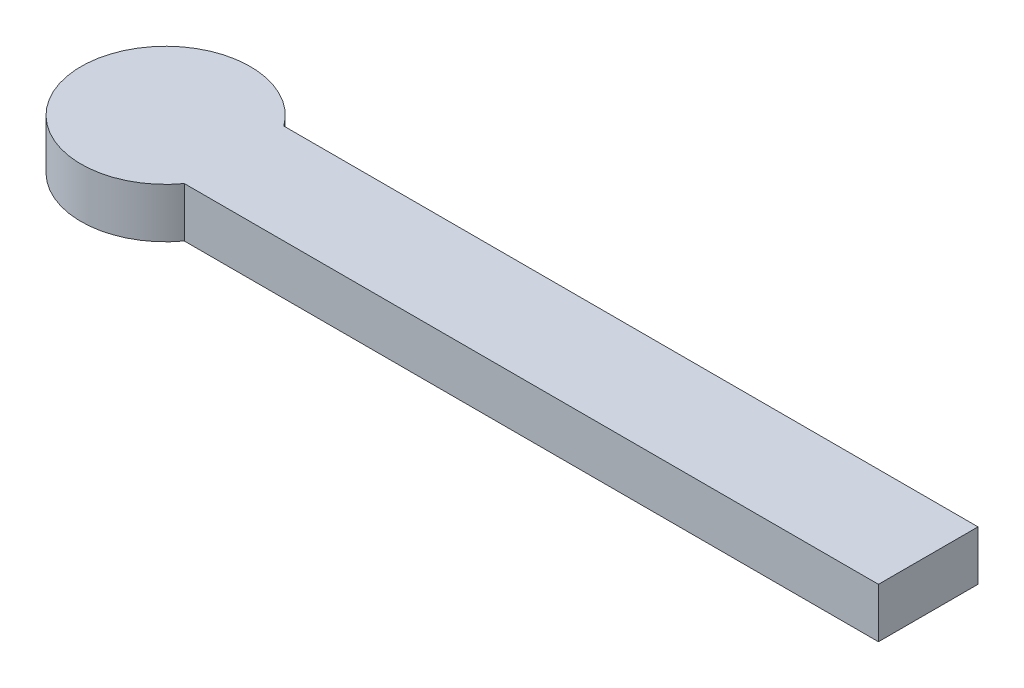
ISO-10303-21;
HEADER;
FILE_DESCRIPTION(('STEP AP214'),'2;1');
FILE_NAME('part.step','',(''),(''),'','','');
FILE_SCHEMA(('AUTOMOTIVE_DESIGN { 1 0 10303 214 1 1 1 1 }'));
ENDSEC;
DATA;
#1=APPLICATION_CONTEXT('core data for automotive mechanical design processes');
#2=APPLICATION_PROTOCOL_DEFINITION('international standard','automotive_design',2000,#1);
#3=PRODUCT_CONTEXT('',#1,'mechanical');
#4=PRODUCT('Part','Part','',(#3));
#5=PRODUCT_RELATED_PRODUCT_CATEGORY('part','',(#4));
#6=PRODUCT_DEFINITION_FORMATION('','',#4);
#7=PRODUCT_DEFINITION_CONTEXT('part definition',#1,'design');
#8=PRODUCT_DEFINITION('design','',#6,#7);
#9=PRODUCT_DEFINITION_SHAPE('','',#8);
#10=(LENGTH_UNIT() NAMED_UNIT(*) SI_UNIT(.MILLI.,.METRE.));
#11=(NAMED_UNIT(*) PLANE_ANGLE_UNIT() SI_UNIT($,.RADIAN.));
#12=(NAMED_UNIT(*) SI_UNIT($,.STERADIAN.) SOLID_ANGLE_UNIT());
#13=UNCERTAINTY_MEASURE_WITH_UNIT(LENGTH_MEASURE(1.E-05),#10,'distance_accuracy_value','');
#14=(GEOMETRIC_REPRESENTATION_CONTEXT(3) GLOBAL_UNCERTAINTY_ASSIGNED_CONTEXT((#13)) GLOBAL_UNIT_ASSIGNED_CONTEXT((#10,
#11,#12)) REPRESENTATION_CONTEXT('',''));
#15=CARTESIAN_POINT('',(0.,0.,0.));
#16=DIRECTION('',(0.,0.,1.));
#17=DIRECTION('',(1.,0.,0.));
#18=AXIS2_PLACEMENT_3D('',#15,#16,#17);
#19=CARTESIAN_POINT('',(40.,5.,5.));
#20=DIRECTION('',(0.,0.,-1.));
#21=DIRECTION('',(-1.,0.,0.));
#22=AXIS2_PLACEMENT_3D('',#19,#20,#21);
#23=PLANE('',#22);
#24=DIRECTION('',(1.,0.,0.));
#25=VECTOR('',#24,1.);
#26=CARTESIAN_POINT('',(40.,5.,5.));
#27=LINE('',#26,#25);
#28=CARTESIAN_POINT('',(-29.7334026807094,5.,5.00000000000001));
#29=VERTEX_POINT('',#28);
#30=CARTESIAN_POINT('',(40.,5.,5.));
#31=VERTEX_POINT('',#30);
#32=EDGE_CURVE('E86',#29,#31,#27,.T.);
#33=ORIENTED_EDGE('',*,*,#32,.F.);
#34=DIRECTION('',(0.,1.,0.));
#35=VECTOR('',#34,1.);
#36=CARTESIAN_POINT('',(-29.7334026807094,0.,5.00000000000001));
#37=LINE('',#36,#35);
#38=CARTESIAN_POINT('',(-29.7334026807094,0.,5.00000000000001));
#39=VERTEX_POINT('',#38);
#40=EDGE_CURVE('E79',#29,#39,#37,.F.);
#41=ORIENTED_EDGE('',*,*,#40,.T.);
#42=DIRECTION('',(1.,0.,0.));
#43=VECTOR('',#42,1.);
#44=CARTESIAN_POINT('',(40.,0.,5.));
#45=LINE('',#44,#43);
#46=CARTESIAN_POINT('',(40.,0.,5.));
#47=VERTEX_POINT('',#46);
#48=EDGE_CURVE('E60',#39,#47,#45,.T.);
#49=ORIENTED_EDGE('',*,*,#48,.T.);
#50=DIRECTION('',(0.,-1.,0.));
#51=VECTOR('',#50,1.);
#52=CARTESIAN_POINT('',(40.,5.,5.));
#53=LINE('',#52,#51);
#54=EDGE_CURVE('E11',#31,#47,#53,.T.);
#55=ORIENTED_EDGE('',*,*,#54,.F.);
#56=EDGE_LOOP('',(#33,#41,#49,#55));
#57=FACE_BOUND('',#56,.T.);
#58=ADVANCED_FACE('F33',(#57),#23,.F.);
#59=CARTESIAN_POINT('',(40.,5.,5.));
#60=DIRECTION('',(-1.,0.,0.));
#61=DIRECTION('',(0.,0.,1.));
#62=AXIS2_PLACEMENT_3D('',#59,#60,#61);
#63=PLANE('',#62);
#64=DIRECTION('',(0.,0.,-1.));
#65=VECTOR('',#64,1.);
#66=CARTESIAN_POINT('',(40.,0.,5.));
#67=LINE('',#66,#65);
#68=CARTESIAN_POINT('',(40.,0.,-5.00000000000001));
#69=VERTEX_POINT('',#68);
#70=EDGE_CURVE('E90',#47,#69,#67,.T.);
#71=ORIENTED_EDGE('',*,*,#70,.T.);
#72=DIRECTION('',(0.,-1.,0.));
#73=VECTOR('',#72,1.);
#74=CARTESIAN_POINT('',(40.,5.,-5.00000000000001));
#75=LINE('',#74,#73);
#76=CARTESIAN_POINT('',(40.,5.,-5.00000000000001));
#77=VERTEX_POINT('',#76);
#78=EDGE_CURVE('E41',#77,#69,#75,.T.);
#79=ORIENTED_EDGE('',*,*,#78,.F.);
#80=DIRECTION('',(0.,0.,-1.));
#81=VECTOR('',#80,1.);
#82=CARTESIAN_POINT('',(40.,5.,5.));
#83=LINE('',#82,#81);
#84=EDGE_CURVE('E49',#31,#77,#83,.T.);
#85=ORIENTED_EDGE('',*,*,#84,.F.);
#86=ORIENTED_EDGE('',*,*,#54,.T.);
#87=EDGE_LOOP('',(#71,#79,#85,#86));
#88=FACE_BOUND('',#87,.T.);
#89=ADVANCED_FACE('F106',(#88),#63,.F.);
#90=CARTESIAN_POINT('',(40.,5.,-5.00000000000001));
#91=DIRECTION('',(0.,0.,1.));
#92=DIRECTION('',(1.,0.,0.));
#93=AXIS2_PLACEMENT_3D('',#90,#91,#92);
#94=PLANE('',#93);
#95=DIRECTION('',(-1.,0.,0.));
#96=VECTOR('',#95,1.);
#97=CARTESIAN_POINT('',(40.,0.,-5.00000000000001));
#98=LINE('',#97,#96);
#99=CARTESIAN_POINT('',(-29.7334026807094,0.,-4.99999999999999));
#100=VERTEX_POINT('',#99);
#101=EDGE_CURVE('E92',#69,#100,#98,.T.);
#102=ORIENTED_EDGE('',*,*,#101,.T.);
#103=DIRECTION('',(0.,1.,0.));
#104=VECTOR('',#103,1.);
#105=CARTESIAN_POINT('',(-29.7334026807094,0.,-5.));
#106=LINE('',#105,#104);
#107=CARTESIAN_POINT('',(-29.7334026807094,5.,-4.99999999999999));
#108=VERTEX_POINT('',#107);
#109=EDGE_CURVE('E80',#100,#108,#106,.T.);
#110=ORIENTED_EDGE('',*,*,#109,.T.);
#111=DIRECTION('',(-1.,0.,0.));
#112=VECTOR('',#111,1.);
#113=CARTESIAN_POINT('',(40.,5.,-5.00000000000001));
#114=LINE('',#113,#112);
#115=EDGE_CURVE('E95',#77,#108,#114,.T.);
#116=ORIENTED_EDGE('',*,*,#115,.F.);
#117=ORIENTED_EDGE('',*,*,#78,.T.);
#118=EDGE_LOOP('',(#102,#110,#116,#117));
#119=FACE_BOUND('',#118,.T.);
#120=ADVANCED_FACE('F107',(#119),#94,.F.);
#121=CARTESIAN_POINT('',(0.,5.,0.));
#122=DIRECTION('',(0.,1.,0.));
#123=DIRECTION('',(0.,0.,1.));
#124=AXIS2_PLACEMENT_3D('',#121,#122,#123);
#125=PLANE('',#124);
#126=CARTESIAN_POINT('',(-36.6072662231431,5.,0.));
#127=DIRECTION('',(0.,1.,0.));
#128=DIRECTION('',(0.,0.,1.));
#129=AXIS2_PLACEMENT_3D('',#126,#127,#128);
#130=CIRCLE('',#129,8.5);
#131=EDGE_CURVE('E68',#108,#29,#130,.T.);
#132=ORIENTED_EDGE('',*,*,#131,.T.);
#133=ORIENTED_EDGE('',*,*,#32,.T.);
#134=ORIENTED_EDGE('',*,*,#84,.T.);
#135=ORIENTED_EDGE('',*,*,#115,.T.);
#136=EDGE_LOOP('',(#132,#133,#134,#135));
#137=FACE_BOUND('',#136,.T.);
#138=ADVANCED_FACE('F104',(#137),#125,.T.);
#139=CARTESIAN_POINT('',(0.,0.,0.));
#140=DIRECTION('',(0.,1.,0.));
#141=DIRECTION('',(0.,0.,1.));
#142=AXIS2_PLACEMENT_3D('',#139,#140,#141);
#143=PLANE('',#142);
#144=ORIENTED_EDGE('',*,*,#48,.F.);
#145=CARTESIAN_POINT('',(-36.6072662231431,0.,0.));
#146=DIRECTION('',(0.,1.,0.));
#147=DIRECTION('',(0.,0.,1.));
#148=AXIS2_PLACEMENT_3D('',#145,#146,#147);
#149=CIRCLE('',#148,8.5);
#150=EDGE_CURVE('E77',#100,#39,#149,.T.);
#151=ORIENTED_EDGE('',*,*,#150,.F.);
#152=ORIENTED_EDGE('',*,*,#101,.F.);
#153=ORIENTED_EDGE('',*,*,#70,.F.);
#154=EDGE_LOOP('',(#144,#151,#152,#153));
#155=FACE_BOUND('',#154,.T.);
#156=ADVANCED_FACE('F89',(#155),#143,.F.);
#157=CARTESIAN_POINT('',(-36.6072662231431,0.,0.));
#158=DIRECTION('',(0.,1.,0.));
#159=DIRECTION('',(0.,0.,1.));
#160=AXIS2_PLACEMENT_3D('',#157,#158,#159);
#161=CYLINDRICAL_SURFACE('',#160,8.5);
#162=ORIENTED_EDGE('',*,*,#40,.F.);
#163=ORIENTED_EDGE('',*,*,#131,.F.);
#164=ORIENTED_EDGE('',*,*,#109,.F.);
#165=ORIENTED_EDGE('',*,*,#150,.T.);
#166=EDGE_LOOP('',(#162,#163,#164,#165));
#167=FACE_BOUND('',#166,.T.);
#168=ADVANCED_FACE('F78',(#167),#161,.T.);
#169=CLOSED_SHELL('',(#58,#89,#120,#138,#156,#168));
#170=MANIFOLD_SOLID_BREP('B2',#169);
#171=ADVANCED_BREP_SHAPE_REPRESENTATION('',(#18,#170),#14);
#172=SHAPE_DEFINITION_REPRESENTATION(#9,#171);
ENDSEC;
END-ISO-10303-21;
